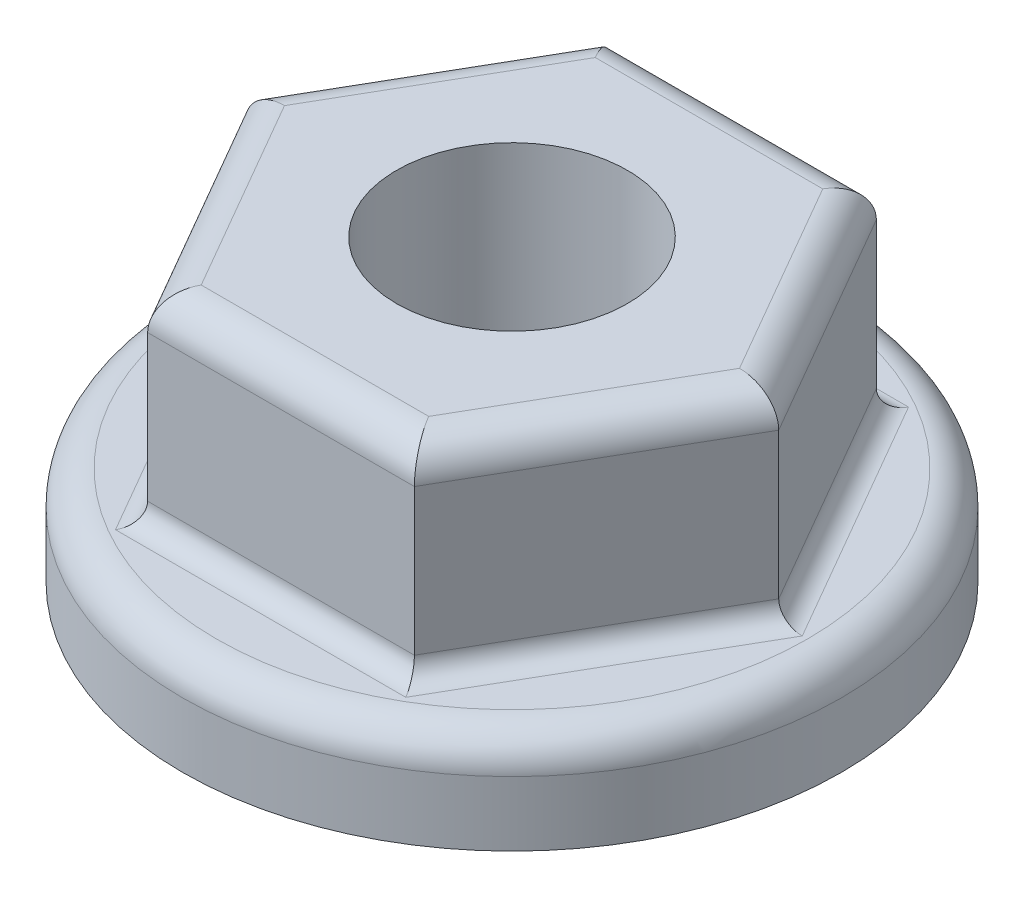
ISO-10303-21;
HEADER;
FILE_DESCRIPTION(('STEP AP214'),'2;1');
FILE_NAME('part.step','',(''),(''),'','','');
FILE_SCHEMA(('AUTOMOTIVE_DESIGN { 1 0 10303 214 1 1 1 1 }'));
ENDSEC;
DATA;
#1=APPLICATION_CONTEXT('core data for automotive mechanical design processes');
#2=APPLICATION_PROTOCOL_DEFINITION('international standard','automotive_design',2000,#1);
#3=PRODUCT_CONTEXT('',#1,'mechanical');
#4=PRODUCT('Part','Part','',(#3));
#5=PRODUCT_RELATED_PRODUCT_CATEGORY('part','',(#4));
#6=PRODUCT_DEFINITION_FORMATION('','',#4);
#7=PRODUCT_DEFINITION_CONTEXT('part definition',#1,'design');
#8=PRODUCT_DEFINITION('design','',#6,#7);
#9=PRODUCT_DEFINITION_SHAPE('','',#8);
#10=(LENGTH_UNIT() NAMED_UNIT(*) SI_UNIT(.MILLI.,.METRE.));
#11=(NAMED_UNIT(*) PLANE_ANGLE_UNIT() SI_UNIT($,.RADIAN.));
#12=(NAMED_UNIT(*) SI_UNIT($,.STERADIAN.) SOLID_ANGLE_UNIT());
#13=UNCERTAINTY_MEASURE_WITH_UNIT(LENGTH_MEASURE(1.E-05),#10,'distance_accuracy_value','');
#14=(GEOMETRIC_REPRESENTATION_CONTEXT(3) GLOBAL_UNCERTAINTY_ASSIGNED_CONTEXT((#13)) GLOBAL_UNIT_ASSIGNED_CONTEXT((#10,
#11,#12)) REPRESENTATION_CONTEXT('',''));
#15=CARTESIAN_POINT('',(0.,0.,0.));
#16=DIRECTION('',(0.,0.,1.));
#17=DIRECTION('',(1.,0.,0.));
#18=AXIS2_PLACEMENT_3D('',#15,#16,#17);
#19=CARTESIAN_POINT('',(33.1828975415283,1.45,0.));
#20=DIRECTION('',(0.,-1.,0.));
#21=DIRECTION('',(0.,0.,-1.));
#22=AXIS2_PLACEMENT_3D('',#19,#20,#21);
#23=CYLINDRICAL_SURFACE('',#22,4.85);
#24=CARTESIAN_POINT('',(33.1828975415283,0.95,0.));
#25=DIRECTION('',(0.,1.,0.));
#26=DIRECTION('',(0.,0.,1.));
#27=AXIS2_PLACEMENT_3D('',#24,#25,#26);
#28=CIRCLE('',#27,4.85);
#29=CARTESIAN_POINT('',(33.1828975415283,0.95,4.85));
#30=VERTEX_POINT('',#29);
#31=EDGE_CURVE('E191',#30,#30,#28,.F.);
#32=ORIENTED_EDGE('',*,*,#31,.T.);
#33=EDGE_LOOP('',(#32));
#34=FACE_BOUND('',#33,.T.);
#35=CARTESIAN_POINT('',(33.1828975415283,0.,0.));
#36=DIRECTION('',(0.,1.,0.));
#37=DIRECTION('',(0.,0.,1.));
#38=AXIS2_PLACEMENT_3D('',#35,#36,#37);
#39=CIRCLE('',#38,4.85);
#40=CARTESIAN_POINT('',(33.1828975415283,0.,4.85));
#41=VERTEX_POINT('',#40);
#42=EDGE_CURVE('E152',#41,#41,#39,.T.);
#43=ORIENTED_EDGE('',*,*,#42,.T.);
#44=EDGE_LOOP('',(#43));
#45=FACE_BOUND('',#44,.T.);
#46=ADVANCED_FACE('F35',(#34,#45),#23,.T.);
#47=CARTESIAN_POINT('',(33.1828975415283,1.45,0.));
#48=DIRECTION('',(0.,1.,0.));
#49=DIRECTION('',(0.,0.,1.));
#50=AXIS2_PLACEMENT_3D('',#47,#48,#49);
#51=PLANE('',#50);
#52=DIRECTION('',(-1.,0.,0.));
#53=VECTOR('',#52,1.);
#54=CARTESIAN_POINT('',(33.1828975415283,1.45,-3.69999999999999));
#55=LINE('',#54,#53);
#56=CARTESIAN_POINT('',(31.0467015455266,1.45,-3.69999999999999));
#57=VERTEX_POINT('',#56);
#58=CARTESIAN_POINT('',(35.3190935375299,1.45,-3.69999999999999));
#59=VERTEX_POINT('',#58);
#60=EDGE_CURVE('E199',#57,#59,#55,.F.);
#61=ORIENTED_EDGE('',*,*,#60,.T.);
#62=DIRECTION('',(-0.5,0.,-0.866025403784439));
#63=VECTOR('',#62,1.);
#64=CARTESIAN_POINT('',(36.3871915355307,1.45,-1.85));
#65=LINE('',#64,#63);
#66=CARTESIAN_POINT('',(37.4552895335315,1.45,0.));
#67=VERTEX_POINT('',#66);
#68=EDGE_CURVE('E207',#59,#67,#65,.F.);
#69=ORIENTED_EDGE('',*,*,#68,.T.);
#70=DIRECTION('',(0.5,0.,-0.866025403784439));
#71=VECTOR('',#70,1.);
#72=CARTESIAN_POINT('',(36.3871915355307,1.45,1.84999999999999));
#73=LINE('',#72,#71);
#74=CARTESIAN_POINT('',(35.3190935375299,1.45,3.69999999999999));
#75=VERTEX_POINT('',#74);
#76=EDGE_CURVE('E205',#67,#75,#73,.F.);
#77=ORIENTED_EDGE('',*,*,#76,.T.);
#78=DIRECTION('',(1.,0.,0.));
#79=VECTOR('',#78,1.);
#80=CARTESIAN_POINT('',(33.1828975415283,1.45,3.69999999999999));
#81=LINE('',#80,#79);
#82=CARTESIAN_POINT('',(31.0467015455266,1.45,3.69999999999999));
#83=VERTEX_POINT('',#82);
#84=EDGE_CURVE('E203',#75,#83,#81,.F.);
#85=ORIENTED_EDGE('',*,*,#84,.T.);
#86=DIRECTION('',(0.5,0.,0.866025403784439));
#87=VECTOR('',#86,1.);
#88=CARTESIAN_POINT('',(29.9786035475258,1.45,1.84999999999999));
#89=LINE('',#88,#87);
#90=CARTESIAN_POINT('',(28.910505549525,1.45,0.));
#91=VERTEX_POINT('',#90);
#92=EDGE_CURVE('E201',#83,#91,#89,.F.);
#93=ORIENTED_EDGE('',*,*,#92,.T.);
#94=DIRECTION('',(-0.499999999999999,0.,0.866025403784439));
#95=VECTOR('',#94,1.);
#96=CARTESIAN_POINT('',(29.9786035475258,1.45,-1.84999999999999));
#97=LINE('',#96,#95);
#98=EDGE_CURVE('E197',#91,#57,#97,.F.);
#99=ORIENTED_EDGE('',*,*,#98,.T.);
#100=EDGE_LOOP('',(#61,#69,#77,#85,#93,#99));
#101=FACE_BOUND('',#100,.T.);
#102=CARTESIAN_POINT('',(33.1828975415283,1.45,0.));
#103=DIRECTION('',(0.,1.,0.));
#104=DIRECTION('',(0.,0.,1.));
#105=AXIS2_PLACEMENT_3D('',#102,#103,#104);
#106=CIRCLE('',#105,4.35);
#107=CARTESIAN_POINT('',(33.1828975415283,1.45,4.35));
#108=VERTEX_POINT('',#107);
#109=EDGE_CURVE('E178',#108,#108,#106,.T.);
#110=ORIENTED_EDGE('',*,*,#109,.T.);
#111=EDGE_LOOP('',(#110));
#112=FACE_BOUND('',#111,.T.);
#113=ADVANCED_FACE('F242',(#101,#112),#51,.T.);
#114=CARTESIAN_POINT('',(33.1828975415283,0.,0.));
#115=DIRECTION('',(0.,1.,0.));
#116=DIRECTION('',(0.,0.,1.));
#117=AXIS2_PLACEMENT_3D('',#114,#115,#116);
#118=PLANE('',#117);
#119=CARTESIAN_POINT('',(33.1828975415283,0.,0.));
#120=DIRECTION('',(0.,1.,0.));
#121=DIRECTION('',(0.,0.,1.));
#122=AXIS2_PLACEMENT_3D('',#119,#120,#121);
#123=CIRCLE('',#122,1.7);
#124=CARTESIAN_POINT('',(33.1828975415283,0.,1.7));
#125=VERTEX_POINT('',#124);
#126=EDGE_CURVE('E275',#125,#125,#123,.T.);
#127=ORIENTED_EDGE('',*,*,#126,.T.);
#128=EDGE_LOOP('',(#127));
#129=FACE_BOUND('',#128,.T.);
#130=ORIENTED_EDGE('',*,*,#42,.F.);
#131=EDGE_LOOP('',(#130));
#132=FACE_BOUND('',#131,.T.);
#133=ADVANCED_FACE('F281',(#129,#132),#118,.F.);
#134=CARTESIAN_POINT('',(35.145888456773,4.4,3.39999999999999));
#135=DIRECTION('',(-0.866025403784439,0.,-0.499999999999999));
#136=DIRECTION('',(-0.5,0.,0.866025403784439));
#137=AXIS2_PLACEMENT_3D('',#134,#135,#136);
#138=PLANE('',#137);
#139=DIRECTION('',(0.,-1.,0.));
#140=VECTOR('',#139,1.);
#141=CARTESIAN_POINT('',(35.145888456773,4.4,3.39999999999999));
#142=LINE('',#141,#140);
#143=CARTESIAN_POINT('',(35.145888456773,3.9,3.39999999999999));
#144=VERTEX_POINT('',#143);
#145=CARTESIAN_POINT('',(35.145888456773,1.75,3.39999999999999));
#146=VERTEX_POINT('',#145);
#147=EDGE_CURVE('E259',#144,#146,#142,.T.);
#148=ORIENTED_EDGE('',*,*,#147,.T.);
#149=DIRECTION('',(0.5,0.,-0.866025403784439));
#150=VECTOR('',#149,1.);
#151=CARTESIAN_POINT('',(35.145888456773,1.75,3.39999999999999));
#152=LINE('',#151,#150);
#153=CARTESIAN_POINT('',(37.1088793720177,1.75,0.));
#154=VERTEX_POINT('',#153);
#155=EDGE_CURVE('E210',#146,#154,#152,.T.);
#156=ORIENTED_EDGE('',*,*,#155,.T.);
#157=DIRECTION('',(0.,-1.,0.));
#158=VECTOR('',#157,1.);
#159=CARTESIAN_POINT('',(37.1088793720177,4.4,0.));
#160=LINE('',#159,#158);
#161=CARTESIAN_POINT('',(37.1088793720177,3.9,0.));
#162=VERTEX_POINT('',#161);
#163=EDGE_CURVE('E155',#162,#154,#160,.T.);
#164=ORIENTED_EDGE('',*,*,#163,.F.);
#165=DIRECTION('',(0.5,0.,-0.866025403784439));
#166=VECTOR('',#165,1.);
#167=CARTESIAN_POINT('',(35.145888456773,3.9,3.39999999999999));
#168=LINE('',#167,#166);
#169=EDGE_CURVE('E166',#162,#144,#168,.F.);
#170=ORIENTED_EDGE('',*,*,#169,.T.);
#171=EDGE_LOOP('',(#148,#156,#164,#170));
#172=FACE_BOUND('',#171,.T.);
#173=ADVANCED_FACE('F256',(#172),#138,.F.);
#174=CARTESIAN_POINT('',(37.1088793720177,4.4,0.));
#175=DIRECTION('',(-0.866025403784439,0.,0.5));
#176=DIRECTION('',(0.5,0.,0.866025403784439));
#177=AXIS2_PLACEMENT_3D('',#174,#175,#176);
#178=PLANE('',#177);
#179=ORIENTED_EDGE('',*,*,#163,.T.);
#180=DIRECTION('',(-0.5,0.,-0.866025403784439));
#181=VECTOR('',#180,1.);
#182=CARTESIAN_POINT('',(37.1088793720177,1.75,0.));
#183=LINE('',#182,#181);
#184=CARTESIAN_POINT('',(35.145888456773,1.75,-3.39999999999999));
#185=VERTEX_POINT('',#184);
#186=EDGE_CURVE('E194',#154,#185,#183,.T.);
#187=ORIENTED_EDGE('',*,*,#186,.T.);
#188=DIRECTION('',(0.,-1.,0.));
#189=VECTOR('',#188,1.);
#190=CARTESIAN_POINT('',(35.145888456773,4.4,-3.39999999999999));
#191=LINE('',#190,#189);
#192=CARTESIAN_POINT('',(35.145888456773,3.9,-3.39999999999999));
#193=VERTEX_POINT('',#192);
#194=EDGE_CURVE('E264',#193,#185,#191,.T.);
#195=ORIENTED_EDGE('',*,*,#194,.F.);
#196=DIRECTION('',(-0.5,0.,-0.866025403784439));
#197=VECTOR('',#196,1.);
#198=CARTESIAN_POINT('',(37.1088793720177,3.9,0.));
#199=LINE('',#198,#197);
#200=EDGE_CURVE('E169',#193,#162,#199,.F.);
#201=ORIENTED_EDGE('',*,*,#200,.T.);
#202=EDGE_LOOP('',(#179,#187,#195,#201));
#203=FACE_BOUND('',#202,.T.);
#204=ADVANCED_FACE('F261',(#203),#178,.F.);
#205=CARTESIAN_POINT('',(35.145888456773,4.4,-3.39999999999999));
#206=DIRECTION('',(0.,0.,1.));
#207=DIRECTION('',(1.,0.,0.));
#208=AXIS2_PLACEMENT_3D('',#205,#206,#207);
#209=PLANE('',#208);
#210=ORIENTED_EDGE('',*,*,#194,.T.);
#211=DIRECTION('',(-1.,0.,0.));
#212=VECTOR('',#211,1.);
#213=CARTESIAN_POINT('',(35.145888456773,1.75,-3.39999999999999));
#214=LINE('',#213,#212);
#215=CARTESIAN_POINT('',(31.2199066262835,1.75,-3.39999999999999));
#216=VERTEX_POINT('',#215);
#217=EDGE_CURVE('E44',#185,#216,#214,.T.);
#218=ORIENTED_EDGE('',*,*,#217,.T.);
#219=DIRECTION('',(0.,-1.,0.));
#220=VECTOR('',#219,1.);
#221=CARTESIAN_POINT('',(31.2199066262835,4.4,-3.39999999999999));
#222=LINE('',#221,#220);
#223=CARTESIAN_POINT('',(31.2199066262835,3.9,-3.39999999999999));
#224=VERTEX_POINT('',#223);
#225=EDGE_CURVE('E265',#224,#216,#222,.T.);
#226=ORIENTED_EDGE('',*,*,#225,.F.);
#227=DIRECTION('',(-1.,0.,0.));
#228=VECTOR('',#227,1.);
#229=CARTESIAN_POINT('',(35.145888456773,3.9,-3.39999999999999));
#230=LINE('',#229,#228);
#231=EDGE_CURVE('E171',#224,#193,#230,.F.);
#232=ORIENTED_EDGE('',*,*,#231,.T.);
#233=EDGE_LOOP('',(#210,#218,#226,#232));
#234=FACE_BOUND('',#233,.T.);
#235=ADVANCED_FACE('F415',(#234),#209,.F.);
#236=CARTESIAN_POINT('',(31.2199066262835,4.4,-3.39999999999999));
#237=DIRECTION('',(0.866025403784439,0.,0.499999999999999));
#238=DIRECTION('',(0.499999999999999,0.,-0.866025403784439));
#239=AXIS2_PLACEMENT_3D('',#236,#237,#238);
#240=PLANE('',#239);
#241=ORIENTED_EDGE('',*,*,#225,.T.);
#242=DIRECTION('',(-0.499999999999999,0.,0.866025403784439));
#243=VECTOR('',#242,1.);
#244=CARTESIAN_POINT('',(31.2199066262835,1.75,-3.39999999999999));
#245=LINE('',#244,#243);
#246=CARTESIAN_POINT('',(29.2569157110388,1.75,0.));
#247=VERTEX_POINT('',#246);
#248=EDGE_CURVE('E11',#216,#247,#245,.T.);
#249=ORIENTED_EDGE('',*,*,#248,.T.);
#250=DIRECTION('',(0.,-1.,0.));
#251=VECTOR('',#250,1.);
#252=CARTESIAN_POINT('',(29.2569157110388,4.4,0.));
#253=LINE('',#252,#251);
#254=CARTESIAN_POINT('',(29.2569157110388,3.9,0.));
#255=VERTEX_POINT('',#254);
#256=EDGE_CURVE('E269',#255,#247,#253,.T.);
#257=ORIENTED_EDGE('',*,*,#256,.F.);
#258=DIRECTION('',(-0.499999999999999,0.,0.866025403784439));
#259=VECTOR('',#258,1.);
#260=CARTESIAN_POINT('',(31.2199066262835,3.9,-3.39999999999999));
#261=LINE('',#260,#259);
#262=EDGE_CURVE('E173',#255,#224,#261,.F.);
#263=ORIENTED_EDGE('',*,*,#262,.T.);
#264=EDGE_LOOP('',(#241,#249,#257,#263));
#265=FACE_BOUND('',#264,.T.);
#266=ADVANCED_FACE('F406',(#265),#240,.F.);
#267=CARTESIAN_POINT('',(29.2569157110388,4.4,0.));
#268=DIRECTION('',(0.866025403784439,0.,-0.5));
#269=DIRECTION('',(-0.5,0.,-0.866025403784439));
#270=AXIS2_PLACEMENT_3D('',#267,#268,#269);
#271=PLANE('',#270);
#272=ORIENTED_EDGE('',*,*,#256,.T.);
#273=DIRECTION('',(0.5,0.,0.866025403784439));
#274=VECTOR('',#273,1.);
#275=CARTESIAN_POINT('',(29.2569157110388,1.75,0.));
#276=LINE('',#275,#274);
#277=CARTESIAN_POINT('',(31.2199066262835,1.75,3.39999999999999));
#278=VERTEX_POINT('',#277);
#279=EDGE_CURVE('E214',#247,#278,#276,.T.);
#280=ORIENTED_EDGE('',*,*,#279,.T.);
#281=DIRECTION('',(0.,-1.,0.));
#282=VECTOR('',#281,1.);
#283=CARTESIAN_POINT('',(31.2199066262835,4.4,3.39999999999999));
#284=LINE('',#283,#282);
#285=CARTESIAN_POINT('',(31.2199066262835,3.9,3.39999999999999));
#286=VERTEX_POINT('',#285);
#287=EDGE_CURVE('E271',#286,#278,#284,.T.);
#288=ORIENTED_EDGE('',*,*,#287,.F.);
#289=DIRECTION('',(0.5,0.,0.866025403784439));
#290=VECTOR('',#289,1.);
#291=CARTESIAN_POINT('',(29.2569157110388,3.9,0.));
#292=LINE('',#291,#290);
#293=EDGE_CURVE('E143',#286,#255,#292,.F.);
#294=ORIENTED_EDGE('',*,*,#293,.T.);
#295=EDGE_LOOP('',(#272,#280,#288,#294));
#296=FACE_BOUND('',#295,.T.);
#297=ADVANCED_FACE('F296',(#296),#271,.F.);
#298=CARTESIAN_POINT('',(31.2199066262835,4.4,3.39999999999999));
#299=DIRECTION('',(0.,0.,-1.));
#300=DIRECTION('',(-1.,0.,0.));
#301=AXIS2_PLACEMENT_3D('',#298,#299,#300);
#302=PLANE('',#301);
#303=ORIENTED_EDGE('',*,*,#287,.T.);
#304=DIRECTION('',(1.,0.,0.));
#305=VECTOR('',#304,1.);
#306=CARTESIAN_POINT('',(31.2199066262835,1.75,3.39999999999999));
#307=LINE('',#306,#305);
#308=EDGE_CURVE('E212',#278,#146,#307,.T.);
#309=ORIENTED_EDGE('',*,*,#308,.T.);
#310=ORIENTED_EDGE('',*,*,#147,.F.);
#311=DIRECTION('',(1.,0.,0.));
#312=VECTOR('',#311,1.);
#313=CARTESIAN_POINT('',(31.2199066262835,3.9,3.39999999999999));
#314=LINE('',#313,#312);
#315=EDGE_CURVE('E176',#144,#286,#314,.F.);
#316=ORIENTED_EDGE('',*,*,#315,.T.);
#317=EDGE_LOOP('',(#303,#309,#310,#316));
#318=FACE_BOUND('',#317,.T.);
#319=ADVANCED_FACE('F291',(#318),#302,.F.);
#320=CARTESIAN_POINT('',(0.,4.4,0.));
#321=DIRECTION('',(0.,1.,0.));
#322=DIRECTION('',(0.,0.,1.));
#323=AXIS2_PLACEMENT_3D('',#320,#321,#322);
#324=PLANE('',#323);
#325=DIRECTION('',(1.,0.,0.));
#326=VECTOR('',#325,1.);
#327=CARTESIAN_POINT('',(35.145888456773,4.4,2.89999999999999));
#328=LINE('',#327,#326);
#329=CARTESIAN_POINT('',(31.5085817608783,4.4,2.89999999999999));
#330=VERTEX_POINT('',#329);
#331=CARTESIAN_POINT('',(34.8572133221782,4.4,2.89999999999999));
#332=VERTEX_POINT('',#331);
#333=EDGE_CURVE('E131',#330,#332,#328,.T.);
#334=ORIENTED_EDGE('',*,*,#333,.T.);
#335=DIRECTION('',(0.5,0.,-0.866025403784439));
#336=VECTOR('',#335,1.);
#337=CARTESIAN_POINT('',(36.6758666701255,4.4,-0.250000000000014));
#338=LINE('',#337,#336);
#339=CARTESIAN_POINT('',(36.5315291028281,4.4,0.));
#340=VERTEX_POINT('',#339);
#341=EDGE_CURVE('E164',#332,#340,#338,.T.);
#342=ORIENTED_EDGE('',*,*,#341,.T.);
#343=DIRECTION('',(-0.5,0.,-0.866025403784439));
#344=VECTOR('',#343,1.);
#345=CARTESIAN_POINT('',(34.7128757548808,4.4,-3.14999999999999));
#346=LINE('',#345,#344);
#347=CARTESIAN_POINT('',(34.8572133221782,4.4,-2.89999999999999));
#348=VERTEX_POINT('',#347);
#349=EDGE_CURVE('E162',#340,#348,#346,.T.);
#350=ORIENTED_EDGE('',*,*,#349,.T.);
#351=DIRECTION('',(-1.,0.,0.));
#352=VECTOR('',#351,1.);
#353=CARTESIAN_POINT('',(31.2199066262835,4.4,-2.89999999999999));
#354=LINE('',#353,#352);
#355=CARTESIAN_POINT('',(31.5085817608784,4.4,-2.89999999999999));
#356=VERTEX_POINT('',#355);
#357=EDGE_CURVE('E160',#348,#356,#354,.T.);
#358=ORIENTED_EDGE('',*,*,#357,.T.);
#359=DIRECTION('',(-0.499999999999999,0.,0.866025403784439));
#360=VECTOR('',#359,1.);
#361=CARTESIAN_POINT('',(29.689928412931,4.4,0.250000000000007));
#362=LINE('',#361,#360);
#363=CARTESIAN_POINT('',(29.8342659802284,4.4,0.));
#364=VERTEX_POINT('',#363);
#365=EDGE_CURVE('E134',#356,#364,#362,.T.);
#366=ORIENTED_EDGE('',*,*,#365,.T.);
#367=DIRECTION('',(0.5,0.,0.866025403784439));
#368=VECTOR('',#367,1.);
#369=CARTESIAN_POINT('',(31.6529193281758,4.4,3.15));
#370=LINE('',#369,#368);
#371=EDGE_CURVE('E125',#364,#330,#370,.T.);
#372=ORIENTED_EDGE('',*,*,#371,.T.);
#373=EDGE_LOOP('',(#334,#342,#350,#358,#366,#372));
#374=FACE_BOUND('',#373,.T.);
#375=CARTESIAN_POINT('',(33.1828975415283,4.4,0.));
#376=DIRECTION('',(0.,1.,0.));
#377=DIRECTION('',(0.,0.,1.));
#378=AXIS2_PLACEMENT_3D('',#375,#376,#377);
#379=CIRCLE('',#378,1.7);
#380=CARTESIAN_POINT('',(33.1828975415283,4.4,1.7));
#381=VERTEX_POINT('',#380);
#382=EDGE_CURVE('E188',#381,#381,#379,.T.);
#383=ORIENTED_EDGE('',*,*,#382,.F.);
#384=EDGE_LOOP('',(#383));
#385=FACE_BOUND('',#384,.T.);
#386=ADVANCED_FACE('F127',(#374,#385),#324,.T.);
#387=CARTESIAN_POINT('',(33.1828975415283,0.,0.));
#388=DIRECTION('',(0.,1.,0.));
#389=DIRECTION('',(0.,0.,1.));
#390=AXIS2_PLACEMENT_3D('',#387,#388,#389);
#391=CYLINDRICAL_SURFACE('',#390,1.7);
#392=ORIENTED_EDGE('',*,*,#126,.F.);
#393=EDGE_LOOP('',(#392));
#394=FACE_BOUND('',#393,.T.);
#395=ORIENTED_EDGE('',*,*,#382,.T.);
#396=EDGE_LOOP('',(#395));
#397=FACE_BOUND('',#396,.T.);
#398=ADVANCED_FACE('F284',(#394,#397),#391,.F.);
#399=CARTESIAN_POINT('',(22.3756994851713,3.9,12.9186161210698));
#400=DIRECTION('',(0.499999999999999,0.,-0.866025403784439));
#401=DIRECTION('',(-0.866025403784439,0.,-0.499999999999999));
#402=AXIS2_PLACEMENT_3D('',#399,#400,#401);
#403=CYLINDRICAL_SURFACE('',#402,0.5);
#404=CARTESIAN_POINT('',(31.5085817608783,3.9,-2.89999999999999));
#405=DIRECTION('',(0.866025403784438,0.,-0.5));
#406=DIRECTION('',(-0.5,0.,-0.866025403784438));
#407=AXIS2_PLACEMENT_3D('',#404,#405,#406);
#408=ELLIPSE('',#407,0.577350269189626,0.5);
#409=EDGE_CURVE('E146',#224,#356,#408,.T.);
#410=ORIENTED_EDGE('',*,*,#409,.F.);
#411=ORIENTED_EDGE('',*,*,#262,.F.);
#412=CARTESIAN_POINT('',(29.8342659802284,3.9,0.));
#413=DIRECTION('',(0.,0.,-1.));
#414=DIRECTION('',(-1.,0.,0.));
#415=AXIS2_PLACEMENT_3D('',#412,#413,#414);
#416=ELLIPSE('',#415,0.577350269189626,0.5);
#417=EDGE_CURVE('E186',#364,#255,#416,.F.);
#418=ORIENTED_EDGE('',*,*,#417,.F.);
#419=ORIENTED_EDGE('',*,*,#365,.F.);
#420=EDGE_LOOP('',(#410,#411,#418,#419));
#421=FACE_BOUND('',#420,.T.);
#422=ADVANCED_FACE('F287',(#421),#403,.T.);
#423=CARTESIAN_POINT('',(22.3756994851713,3.9,-12.9186161210698));
#424=DIRECTION('',(-0.5,0.,-0.866025403784439));
#425=DIRECTION('',(-0.866025403784439,0.,0.5));
#426=AXIS2_PLACEMENT_3D('',#423,#424,#425);
#427=CYLINDRICAL_SURFACE('',#426,0.5);
#428=ORIENTED_EDGE('',*,*,#417,.T.);
#429=ORIENTED_EDGE('',*,*,#293,.F.);
#430=CARTESIAN_POINT('',(31.5085817608783,3.9,2.9));
#431=DIRECTION('',(-0.866025403784439,0.,-0.5));
#432=DIRECTION('',(-0.5,0.,0.866025403784439));
#433=AXIS2_PLACEMENT_3D('',#430,#431,#432);
#434=ELLIPSE('',#433,0.577350269189626,0.5);
#435=EDGE_CURVE('E141',#330,#286,#434,.F.);
#436=ORIENTED_EDGE('',*,*,#435,.F.);
#437=ORIENTED_EDGE('',*,*,#371,.F.);
#438=EDGE_LOOP('',(#428,#429,#436,#437));
#439=FACE_BOUND('',#438,.T.);
#440=ADVANCED_FACE('F142',(#439),#427,.T.);
#441=CARTESIAN_POINT('',(0.,3.9,-2.89999999999999));
#442=DIRECTION('',(1.,0.,0.));
#443=DIRECTION('',(0.,0.,-1.));
#444=AXIS2_PLACEMENT_3D('',#441,#442,#443);
#445=CYLINDRICAL_SURFACE('',#444,0.5);
#446=ORIENTED_EDGE('',*,*,#409,.T.);
#447=ORIENTED_EDGE('',*,*,#357,.F.);
#448=CARTESIAN_POINT('',(34.8572133221782,3.9,-2.89999999999999));
#449=DIRECTION('',(0.866025403784439,0.,0.5));
#450=DIRECTION('',(0.5,0.,-0.866025403784439));
#451=AXIS2_PLACEMENT_3D('',#448,#449,#450);
#452=ELLIPSE('',#451,0.577350269189626,0.5);
#453=EDGE_CURVE('E147',#193,#348,#452,.T.);
#454=ORIENTED_EDGE('',*,*,#453,.F.);
#455=ORIENTED_EDGE('',*,*,#231,.F.);
#456=EDGE_LOOP('',(#446,#447,#454,#455));
#457=FACE_BOUND('',#456,.T.);
#458=ADVANCED_FACE('F320',(#457),#445,.T.);
#459=CARTESIAN_POINT('',(0.,3.9,2.89999999999999));
#460=DIRECTION('',(-1.,0.,0.));
#461=DIRECTION('',(0.,0.,1.));
#462=AXIS2_PLACEMENT_3D('',#459,#460,#461);
#463=CYLINDRICAL_SURFACE('',#462,0.5);
#464=ORIENTED_EDGE('',*,*,#435,.T.);
#465=ORIENTED_EDGE('',*,*,#315,.F.);
#466=CARTESIAN_POINT('',(34.8572133221781,3.9,2.89999999999999));
#467=DIRECTION('',(-0.866025403784438,0.,0.5));
#468=DIRECTION('',(-0.5,0.,-0.866025403784439));
#469=AXIS2_PLACEMENT_3D('',#466,#467,#468);
#470=ELLIPSE('',#469,0.577350269189626,0.5);
#471=EDGE_CURVE('E150',#332,#144,#470,.F.);
#472=ORIENTED_EDGE('',*,*,#471,.F.);
#473=ORIENTED_EDGE('',*,*,#333,.F.);
#474=EDGE_LOOP('',(#464,#465,#472,#473));
#475=FACE_BOUND('',#474,.T.);
#476=ADVANCED_FACE('F149',(#475),#463,.T.);
#477=CARTESIAN_POINT('',(27.3986468271211,3.9,-15.8186161210698));
#478=DIRECTION('',(0.5,0.,0.866025403784439));
#479=DIRECTION('',(0.866025403784439,0.,-0.5));
#480=AXIS2_PLACEMENT_3D('',#477,#478,#479);
#481=CYLINDRICAL_SURFACE('',#480,0.5);
#482=ORIENTED_EDGE('',*,*,#453,.T.);
#483=ORIENTED_EDGE('',*,*,#349,.F.);
#484=CARTESIAN_POINT('',(36.5315291028281,3.9,0.));
#485=DIRECTION('',(0.,0.,1.));
#486=DIRECTION('',(1.,0.,0.));
#487=AXIS2_PLACEMENT_3D('',#484,#485,#486);
#488=ELLIPSE('',#487,0.577350269189626,0.5);
#489=EDGE_CURVE('E179',#162,#340,#488,.T.);
#490=ORIENTED_EDGE('',*,*,#489,.F.);
#491=ORIENTED_EDGE('',*,*,#200,.F.);
#492=EDGE_LOOP('',(#482,#483,#490,#491));
#493=FACE_BOUND('',#492,.T.);
#494=ADVANCED_FACE('F313',(#493),#481,.T.);
#495=CARTESIAN_POINT('',(27.3986468271211,3.9,15.8186161210698));
#496=DIRECTION('',(-0.5,0.,0.866025403784439));
#497=DIRECTION('',(0.866025403784439,0.,0.499999999999999));
#498=AXIS2_PLACEMENT_3D('',#495,#496,#497);
#499=CYLINDRICAL_SURFACE('',#498,0.5);
#500=ORIENTED_EDGE('',*,*,#471,.T.);
#501=ORIENTED_EDGE('',*,*,#169,.F.);
#502=ORIENTED_EDGE('',*,*,#489,.T.);
#503=ORIENTED_EDGE('',*,*,#341,.F.);
#504=EDGE_LOOP('',(#500,#501,#502,#503));
#505=FACE_BOUND('',#504,.T.);
#506=ADVANCED_FACE('F309',(#505),#499,.T.);
#507=CARTESIAN_POINT('',(33.1828975415283,0.95,0.));
#508=DIRECTION('',(0.,1.,0.));
#509=DIRECTION('',(0.,0.,1.));
#510=AXIS2_PLACEMENT_3D('',#507,#508,#509);
#511=TOROIDAL_SURFACE('',#510,4.35,0.5);
#512=ORIENTED_EDGE('',*,*,#31,.F.);
#513=EDGE_LOOP('',(#512));
#514=FACE_BOUND('',#513,.T.);
#515=ORIENTED_EDGE('',*,*,#109,.F.);
#516=EDGE_LOOP('',(#515));
#517=FACE_BOUND('',#516,.T.);
#518=ADVANCED_FACE('F312',(#514,#517),#511,.T.);
#519=CARTESIAN_POINT('',(28.9971080899035,1.75,0.150000000000003));
#520=DIRECTION('',(0.5,0.,0.866025403784439));
#521=DIRECTION('',(0.866025403784439,0.,-0.5));
#522=AXIS2_PLACEMENT_3D('',#519,#520,#521);
#523=CYLINDRICAL_SURFACE('',#522,0.3);
#524=CARTESIAN_POINT('',(28.910505549525,1.75,0.));
#525=DIRECTION('',(0.,0.,1.));
#526=DIRECTION('',(-1.,0.,0.));
#527=AXIS2_PLACEMENT_3D('',#524,#525,#526);
#528=ELLIPSE('',#527,0.346410161513775,0.3);
#529=EDGE_CURVE('E226',#91,#247,#528,.T.);
#530=ORIENTED_EDGE('',*,*,#529,.F.);
#531=ORIENTED_EDGE('',*,*,#92,.F.);
#532=CARTESIAN_POINT('',(31.0467015455266,1.75,3.69999999999999));
#533=DIRECTION('',(0.866025403784439,0.,0.5));
#534=DIRECTION('',(-0.5,0.,0.866025403784439));
#535=AXIS2_PLACEMENT_3D('',#532,#533,#534);
#536=ELLIPSE('',#535,0.346410161513775,0.3);
#537=EDGE_CURVE('E39',#278,#83,#536,.F.);
#538=ORIENTED_EDGE('',*,*,#537,.F.);
#539=ORIENTED_EDGE('',*,*,#279,.F.);
#540=EDGE_LOOP('',(#530,#531,#538,#539));
#541=FACE_BOUND('',#540,.T.);
#542=ADVANCED_FACE('F37',(#541),#523,.F.);
#543=CARTESIAN_POINT('',(31.2199066262835,1.75,3.69999999999999));
#544=DIRECTION('',(1.,0.,0.));
#545=DIRECTION('',(0.,0.,-1.));
#546=AXIS2_PLACEMENT_3D('',#543,#544,#545);
#547=CYLINDRICAL_SURFACE('',#546,0.3);
#548=ORIENTED_EDGE('',*,*,#537,.T.);
#549=ORIENTED_EDGE('',*,*,#84,.F.);
#550=CARTESIAN_POINT('',(35.3190935375299,1.75,3.69999999999999));
#551=DIRECTION('',(0.866025403784438,0.,-0.5));
#552=DIRECTION('',(0.5,0.,0.866025403784439));
#553=AXIS2_PLACEMENT_3D('',#550,#551,#552);
#554=ELLIPSE('',#553,0.346410161513776,0.3);
#555=EDGE_CURVE('E224',#146,#75,#554,.F.);
#556=ORIENTED_EDGE('',*,*,#555,.F.);
#557=ORIENTED_EDGE('',*,*,#308,.F.);
#558=EDGE_LOOP('',(#548,#549,#556,#557));
#559=FACE_BOUND('',#558,.T.);
#560=ADVANCED_FACE('F236',(#559),#547,.F.);
#561=CARTESIAN_POINT('',(30.9600990051482,1.75,-3.54999999999999));
#562=DIRECTION('',(-0.499999999999999,0.,0.866025403784439));
#563=DIRECTION('',(0.866025403784439,0.,0.499999999999999));
#564=AXIS2_PLACEMENT_3D('',#561,#562,#563);
#565=CYLINDRICAL_SURFACE('',#564,0.3);
#566=ORIENTED_EDGE('',*,*,#529,.T.);
#567=ORIENTED_EDGE('',*,*,#248,.F.);
#568=CARTESIAN_POINT('',(31.0467015455266,1.75,-3.69999999999999));
#569=DIRECTION('',(-0.866025403784438,0.,0.5));
#570=DIRECTION('',(0.5,0.,0.866025403784438));
#571=AXIS2_PLACEMENT_3D('',#568,#569,#570);
#572=ELLIPSE('',#571,0.346410161513776,0.3);
#573=EDGE_CURVE('E221',#57,#216,#572,.T.);
#574=ORIENTED_EDGE('',*,*,#573,.F.);
#575=ORIENTED_EDGE('',*,*,#98,.F.);
#576=EDGE_LOOP('',(#566,#567,#574,#575));
#577=FACE_BOUND('',#576,.T.);
#578=ADVANCED_FACE('F342',(#577),#565,.F.);
#579=CARTESIAN_POINT('',(35.4056960779083,1.75,3.54999999999999));
#580=DIRECTION('',(0.5,0.,-0.866025403784439));
#581=DIRECTION('',(-0.866025403784439,0.,-0.499999999999999));
#582=AXIS2_PLACEMENT_3D('',#579,#580,#581);
#583=CYLINDRICAL_SURFACE('',#582,0.3);
#584=ORIENTED_EDGE('',*,*,#555,.T.);
#585=ORIENTED_EDGE('',*,*,#76,.F.);
#586=CARTESIAN_POINT('',(37.4552895335315,1.75,0.));
#587=DIRECTION('',(0.,0.,-1.));
#588=DIRECTION('',(1.,0.,0.));
#589=AXIS2_PLACEMENT_3D('',#586,#587,#588);
#590=ELLIPSE('',#589,0.346410161513775,0.3);
#591=EDGE_CURVE('E219',#154,#67,#590,.F.);
#592=ORIENTED_EDGE('',*,*,#591,.F.);
#593=ORIENTED_EDGE('',*,*,#155,.F.);
#594=EDGE_LOOP('',(#584,#585,#592,#593));
#595=FACE_BOUND('',#594,.T.);
#596=ADVANCED_FACE('F249',(#595),#583,.F.);
#597=CARTESIAN_POINT('',(35.145888456773,1.75,-3.69999999999999));
#598=DIRECTION('',(-1.,0.,0.));
#599=DIRECTION('',(0.,0.,1.));
#600=AXIS2_PLACEMENT_3D('',#597,#598,#599);
#601=CYLINDRICAL_SURFACE('',#600,0.3);
#602=ORIENTED_EDGE('',*,*,#573,.T.);
#603=ORIENTED_EDGE('',*,*,#217,.F.);
#604=CARTESIAN_POINT('',(35.3190935375299,1.75,-3.69999999999999));
#605=DIRECTION('',(-0.866025403784439,0.,-0.5));
#606=DIRECTION('',(-0.5,0.,0.866025403784439));
#607=AXIS2_PLACEMENT_3D('',#604,#605,#606);
#608=ELLIPSE('',#607,0.346410161513775,0.3);
#609=EDGE_CURVE('E217',#59,#185,#608,.T.);
#610=ORIENTED_EDGE('',*,*,#609,.F.);
#611=ORIENTED_EDGE('',*,*,#60,.F.);
#612=EDGE_LOOP('',(#602,#603,#610,#611));
#613=FACE_BOUND('',#612,.T.);
#614=ADVANCED_FACE('F335',(#613),#601,.F.);
#615=CARTESIAN_POINT('',(37.368686993153,1.75,-0.150000000000007));
#616=DIRECTION('',(-0.5,0.,-0.866025403784439));
#617=DIRECTION('',(-0.866025403784439,0.,0.5));
#618=AXIS2_PLACEMENT_3D('',#615,#616,#617);
#619=CYLINDRICAL_SURFACE('',#618,0.3);
#620=ORIENTED_EDGE('',*,*,#591,.T.);
#621=ORIENTED_EDGE('',*,*,#68,.F.);
#622=ORIENTED_EDGE('',*,*,#609,.T.);
#623=ORIENTED_EDGE('',*,*,#186,.F.);
#624=EDGE_LOOP('',(#620,#621,#622,#623));
#625=FACE_BOUND('',#624,.T.);
#626=ADVANCED_FACE('F332',(#625),#619,.F.);
#627=CLOSED_SHELL('',(#46,#113,#133,#173,#204,#235,#266,#297,#319,#386,#398,#422,#440,#458,#476,
#494,#506,#518,#542,#560,#578,#596,#614,#626));
#628=MANIFOLD_SOLID_BREP('B2',#627);
#629=ADVANCED_BREP_SHAPE_REPRESENTATION('',(#18,#628),#14);
#630=SHAPE_DEFINITION_REPRESENTATION(#9,#629);
ENDSEC;
END-ISO-10303-21;
